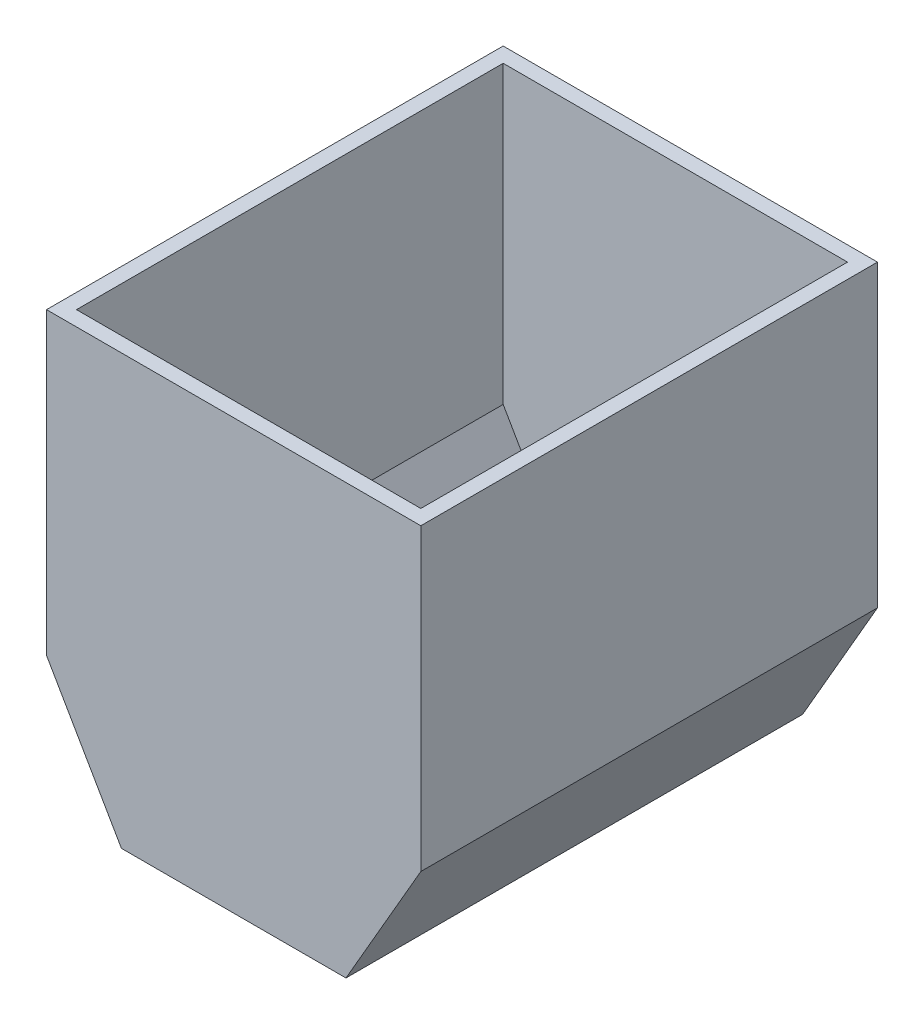
ISO-10303-21;
HEADER;
FILE_DESCRIPTION(('STEP AP214'),'2;1');
FILE_NAME('part.step','',(''),(''),'','','');
FILE_SCHEMA(('AUTOMOTIVE_DESIGN { 1 0 10303 214 1 1 1 1 }'));
ENDSEC;
DATA;
#1=APPLICATION_CONTEXT('core data for automotive mechanical design processes');
#2=APPLICATION_PROTOCOL_DEFINITION('international standard','automotive_design',2000,#1);
#3=PRODUCT_CONTEXT('',#1,'mechanical');
#4=PRODUCT('Part','Part','',(#3));
#5=PRODUCT_RELATED_PRODUCT_CATEGORY('part','',(#4));
#6=PRODUCT_DEFINITION_FORMATION('','',#4);
#7=PRODUCT_DEFINITION_CONTEXT('part definition',#1,'design');
#8=PRODUCT_DEFINITION('design','',#6,#7);
#9=PRODUCT_DEFINITION_SHAPE('','',#8);
#10=(LENGTH_UNIT() NAMED_UNIT(*) SI_UNIT(.MILLI.,.METRE.));
#11=(NAMED_UNIT(*) PLANE_ANGLE_UNIT() SI_UNIT($,.RADIAN.));
#12=(NAMED_UNIT(*) SI_UNIT($,.STERADIAN.) SOLID_ANGLE_UNIT());
#13=UNCERTAINTY_MEASURE_WITH_UNIT(LENGTH_MEASURE(1.E-05),#10,'distance_accuracy_value','');
#14=(GEOMETRIC_REPRESENTATION_CONTEXT(3) GLOBAL_UNCERTAINTY_ASSIGNED_CONTEXT((#13)) GLOBAL_UNIT_ASSIGNED_CONTEXT((#10,
#11,#12)) REPRESENTATION_CONTEXT('',''));
#15=CARTESIAN_POINT('',(0.,0.,0.));
#16=DIRECTION('',(0.,0.,1.));
#17=DIRECTION('',(1.,0.,0.));
#18=AXIS2_PLACEMENT_3D('',#15,#16,#17);
#19=CARTESIAN_POINT('',(31.75,72.7970452561247,38.735));
#20=DIRECTION('',(0.,-1.,0.));
#21=DIRECTION('',(0.,0.,-1.));
#22=AXIS2_PLACEMENT_3D('',#19,#20,#21);
#23=PLANE('',#22);
#24=DIRECTION('',(-1.,0.,0.));
#25=VECTOR('',#24,1.);
#26=CARTESIAN_POINT('',(31.75,72.7970452561247,-38.735));
#27=LINE('',#26,#25);
#28=CARTESIAN_POINT('',(31.75,72.7970452561247,-38.735));
#29=VERTEX_POINT('',#28);
#30=CARTESIAN_POINT('',(-31.75,72.7970452561247,-38.735));
#31=VERTEX_POINT('',#30);
#32=EDGE_CURVE('E263',#29,#31,#27,.T.);
#33=ORIENTED_EDGE('',*,*,#32,.T.);
#34=DIRECTION('',(0.,0.,-1.));
#35=VECTOR('',#34,1.);
#36=CARTESIAN_POINT('',(-31.75,72.7970452561247,38.735));
#37=LINE('',#36,#35);
#38=CARTESIAN_POINT('',(-31.75,72.7970452561247,38.735));
#39=VERTEX_POINT('',#38);
#40=EDGE_CURVE('E51',#39,#31,#37,.T.);
#41=ORIENTED_EDGE('',*,*,#40,.F.);
#42=DIRECTION('',(-1.,0.,0.));
#43=VECTOR('',#42,1.);
#44=CARTESIAN_POINT('',(31.75,72.7970452561247,38.735));
#45=LINE('',#44,#43);
#46=CARTESIAN_POINT('',(31.75,72.7970452561247,38.735));
#47=VERTEX_POINT('',#46);
#48=EDGE_CURVE('E243',#47,#39,#45,.T.);
#49=ORIENTED_EDGE('',*,*,#48,.F.);
#50=DIRECTION('',(0.,0.,-1.));
#51=VECTOR('',#50,1.);
#52=CARTESIAN_POINT('',(31.75,72.7970452561247,38.735));
#53=LINE('',#52,#51);
#54=EDGE_CURVE('E11',#47,#29,#53,.T.);
#55=ORIENTED_EDGE('',*,*,#54,.T.);
#56=EDGE_LOOP('',(#33,#41,#49,#55));
#57=FACE_BOUND('',#56,.T.);
#58=DIRECTION('',(-1.,0.,0.));
#59=VECTOR('',#58,1.);
#60=CARTESIAN_POINT('',(31.75,72.7970452561247,-36.195));
#61=LINE('',#60,#59);
#62=CARTESIAN_POINT('',(29.21,72.7970452561247,-36.195));
#63=VERTEX_POINT('',#62);
#64=CARTESIAN_POINT('',(-29.21,72.7970452561247,-36.195));
#65=VERTEX_POINT('',#64);
#66=EDGE_CURVE('E189',#63,#65,#61,.T.);
#67=ORIENTED_EDGE('',*,*,#66,.F.);
#68=DIRECTION('',(0.,0.,-1.));
#69=VECTOR('',#68,1.);
#70=CARTESIAN_POINT('',(29.21,72.7970452561247,38.735));
#71=LINE('',#70,#69);
#72=CARTESIAN_POINT('',(29.21,72.7970452561247,36.195));
#73=VERTEX_POINT('',#72);
#74=EDGE_CURVE('E227',#73,#63,#71,.T.);
#75=ORIENTED_EDGE('',*,*,#74,.F.);
#76=DIRECTION('',(-1.,0.,0.));
#77=VECTOR('',#76,1.);
#78=CARTESIAN_POINT('',(31.75,72.7970452561247,36.195));
#79=LINE('',#78,#77);
#80=CARTESIAN_POINT('',(-29.21,72.7970452561247,36.195));
#81=VERTEX_POINT('',#80);
#82=EDGE_CURVE('E192',#73,#81,#79,.T.);
#83=ORIENTED_EDGE('',*,*,#82,.T.);
#84=DIRECTION('',(0.,0.,-1.));
#85=VECTOR('',#84,1.);
#86=CARTESIAN_POINT('',(-29.21,72.7970452561247,38.735));
#87=LINE('',#86,#85);
#88=EDGE_CURVE('E222',#81,#65,#87,.T.);
#89=ORIENTED_EDGE('',*,*,#88,.T.);
#90=EDGE_LOOP('',(#67,#75,#83,#89));
#91=FACE_BOUND('',#90,.T.);
#92=ADVANCED_FACE('F42',(#57,#91),#23,.F.);
#93=CARTESIAN_POINT('',(31.75,21.9970452561247,38.735));
#94=DIRECTION('',(-1.,0.,0.));
#95=DIRECTION('',(0.,-1.,0.));
#96=AXIS2_PLACEMENT_3D('',#93,#94,#95);
#97=PLANE('',#96);
#98=DIRECTION('',(0.,1.,0.));
#99=VECTOR('',#98,1.);
#100=CARTESIAN_POINT('',(31.75,21.9970452561247,-38.735));
#101=LINE('',#100,#99);
#102=CARTESIAN_POINT('',(31.75,21.9970452561247,-38.735));
#103=VERTEX_POINT('',#102);
#104=EDGE_CURVE('E230',#103,#29,#101,.T.);
#105=ORIENTED_EDGE('',*,*,#104,.T.);
#106=ORIENTED_EDGE('',*,*,#54,.F.);
#107=DIRECTION('',(0.,1.,0.));
#108=VECTOR('',#107,1.);
#109=CARTESIAN_POINT('',(31.75,21.9970452561247,38.735));
#110=LINE('',#109,#108);
#111=CARTESIAN_POINT('',(31.75,21.9970452561247,38.735));
#112=VERTEX_POINT('',#111);
#113=EDGE_CURVE('E239',#112,#47,#110,.T.);
#114=ORIENTED_EDGE('',*,*,#113,.F.);
#115=DIRECTION('',(0.,0.,-1.));
#116=VECTOR('',#115,1.);
#117=CARTESIAN_POINT('',(31.75,21.9970452561247,38.735));
#118=LINE('',#117,#116);
#119=EDGE_CURVE('E259',#112,#103,#118,.T.);
#120=ORIENTED_EDGE('',*,*,#119,.T.);
#121=EDGE_LOOP('',(#105,#106,#114,#120));
#122=FACE_BOUND('',#121,.T.);
#123=ADVANCED_FACE('F44',(#122),#97,.F.);
#124=CARTESIAN_POINT('',(-31.75,72.7970452561247,38.735));
#125=DIRECTION('',(1.,0.,0.));
#126=DIRECTION('',(0.,0.,-1.));
#127=AXIS2_PLACEMENT_3D('',#124,#125,#126);
#128=PLANE('',#127);
#129=DIRECTION('',(0.,-1.,0.));
#130=VECTOR('',#129,1.);
#131=CARTESIAN_POINT('',(-31.75,72.7970452561247,-38.735));
#132=LINE('',#131,#130);
#133=CARTESIAN_POINT('',(-31.75,21.9970452561247,-38.735));
#134=VERTEX_POINT('',#133);
#135=EDGE_CURVE('E266',#31,#134,#132,.T.);
#136=ORIENTED_EDGE('',*,*,#135,.T.);
#137=DIRECTION('',(0.,0.,-1.));
#138=VECTOR('',#137,1.);
#139=CARTESIAN_POINT('',(-31.75,21.9970452561247,38.735));
#140=LINE('',#139,#138);
#141=CARTESIAN_POINT('',(-31.75,21.9970452561247,38.735));
#142=VERTEX_POINT('',#141);
#143=EDGE_CURVE('E288',#142,#134,#140,.T.);
#144=ORIENTED_EDGE('',*,*,#143,.F.);
#145=DIRECTION('',(0.,-1.,0.));
#146=VECTOR('',#145,1.);
#147=CARTESIAN_POINT('',(-31.75,72.7970452561247,38.735));
#148=LINE('',#147,#146);
#149=EDGE_CURVE('E247',#39,#142,#148,.T.);
#150=ORIENTED_EDGE('',*,*,#149,.F.);
#151=ORIENTED_EDGE('',*,*,#40,.T.);
#152=EDGE_LOOP('',(#136,#144,#150,#151));
#153=FACE_BOUND('',#152,.T.);
#154=ADVANCED_FACE('F298',(#153),#128,.F.);
#155=CARTESIAN_POINT('',(-31.75,21.9970452561247,38.735));
#156=DIRECTION('',(0.866025403784438,0.500000000000001,0.));
#157=DIRECTION('',(-0.500000000000001,0.866025403784438,0.));
#158=AXIS2_PLACEMENT_3D('',#155,#156,#157);
#159=PLANE('',#158);
#160=DIRECTION('',(0.500000000000001,-0.866025403784438,0.));
#161=VECTOR('',#160,1.);
#162=CARTESIAN_POINT('',(-31.75,21.9970452561247,-38.735));
#163=LINE('',#162,#161);
#164=CARTESIAN_POINT('',(-19.05,0.,-38.735));
#165=VERTEX_POINT('',#164);
#166=EDGE_CURVE('E269',#134,#165,#163,.T.);
#167=ORIENTED_EDGE('',*,*,#166,.T.);
#168=DIRECTION('',(0.,0.,-1.));
#169=VECTOR('',#168,1.);
#170=CARTESIAN_POINT('',(-19.05,0.,38.735));
#171=LINE('',#170,#169);
#172=CARTESIAN_POINT('',(-19.05,0.,38.735));
#173=VERTEX_POINT('',#172);
#174=EDGE_CURVE('E284',#173,#165,#171,.T.);
#175=ORIENTED_EDGE('',*,*,#174,.F.);
#176=DIRECTION('',(0.500000000000001,-0.866025403784438,0.));
#177=VECTOR('',#176,1.);
#178=CARTESIAN_POINT('',(-31.75,21.9970452561247,38.735));
#179=LINE('',#178,#177);
#180=EDGE_CURVE('E250',#142,#173,#179,.T.);
#181=ORIENTED_EDGE('',*,*,#180,.F.);
#182=ORIENTED_EDGE('',*,*,#143,.T.);
#183=EDGE_LOOP('',(#167,#175,#181,#182));
#184=FACE_BOUND('',#183,.T.);
#185=ADVANCED_FACE('F309',(#184),#159,.F.);
#186=CARTESIAN_POINT('',(-19.05,0.,38.735));
#187=DIRECTION('',(0.,1.,0.));
#188=DIRECTION('',(-1.,0.,0.));
#189=AXIS2_PLACEMENT_3D('',#186,#187,#188);
#190=PLANE('',#189);
#191=DIRECTION('',(1.,0.,0.));
#192=VECTOR('',#191,1.);
#193=CARTESIAN_POINT('',(-17.5835303162583,0.,36.195));
#194=LINE('',#193,#192);
#195=CARTESIAN_POINT('',(-17.5835303162583,0.,36.195));
#196=VERTEX_POINT('',#195);
#197=CARTESIAN_POINT('',(17.5835303162583,0.,36.195));
#198=VERTEX_POINT('',#197);
#199=EDGE_CURVE('E157',#196,#198,#194,.T.);
#200=ORIENTED_EDGE('',*,*,#199,.T.);
#201=DIRECTION('',(0.,0.,-1.));
#202=VECTOR('',#201,1.);
#203=CARTESIAN_POINT('',(17.5835303162583,0.,-36.195));
#204=LINE('',#203,#202);
#205=CARTESIAN_POINT('',(17.5835303162583,0.,-36.195));
#206=VERTEX_POINT('',#205);
#207=EDGE_CURVE('E149',#198,#206,#204,.T.);
#208=ORIENTED_EDGE('',*,*,#207,.T.);
#209=DIRECTION('',(-1.,0.,0.));
#210=VECTOR('',#209,1.);
#211=CARTESIAN_POINT('',(-17.5835303162583,0.,-36.195));
#212=LINE('',#211,#210);
#213=CARTESIAN_POINT('',(-17.5835303162583,0.,-36.195));
#214=VERTEX_POINT('',#213);
#215=EDGE_CURVE('E160',#206,#214,#212,.T.);
#216=ORIENTED_EDGE('',*,*,#215,.T.);
#217=DIRECTION('',(0.,0.,1.));
#218=VECTOR('',#217,1.);
#219=CARTESIAN_POINT('',(-17.5835303162583,0.,-36.195));
#220=LINE('',#219,#218);
#221=EDGE_CURVE('E58',#214,#196,#220,.T.);
#222=ORIENTED_EDGE('',*,*,#221,.T.);
#223=EDGE_LOOP('',(#200,#208,#216,#222));
#224=FACE_BOUND('',#223,.T.);
#225=DIRECTION('',(1.,0.,0.));
#226=VECTOR('',#225,1.);
#227=CARTESIAN_POINT('',(-19.05,0.,-38.735));
#228=LINE('',#227,#226);
#229=CARTESIAN_POINT('',(19.05,0.,-38.735));
#230=VERTEX_POINT('',#229);
#231=EDGE_CURVE('E272',#165,#230,#228,.T.);
#232=ORIENTED_EDGE('',*,*,#231,.T.);
#233=DIRECTION('',(0.,0.,-1.));
#234=VECTOR('',#233,1.);
#235=CARTESIAN_POINT('',(19.05,0.,38.735));
#236=LINE('',#235,#234);
#237=CARTESIAN_POINT('',(19.05,0.,38.735));
#238=VERTEX_POINT('',#237);
#239=EDGE_CURVE('E280',#238,#230,#236,.T.);
#240=ORIENTED_EDGE('',*,*,#239,.F.);
#241=DIRECTION('',(1.,0.,0.));
#242=VECTOR('',#241,1.);
#243=CARTESIAN_POINT('',(-19.05,0.,38.735));
#244=LINE('',#243,#242);
#245=EDGE_CURVE('E253',#173,#238,#244,.T.);
#246=ORIENTED_EDGE('',*,*,#245,.F.);
#247=ORIENTED_EDGE('',*,*,#174,.T.);
#248=EDGE_LOOP('',(#232,#240,#246,#247));
#249=FACE_BOUND('',#248,.T.);
#250=ADVANCED_FACE('F167',(#224,#249),#190,.F.);
#251=CARTESIAN_POINT('',(19.05,0.,38.735));
#252=DIRECTION('',(-0.866025403784438,0.500000000000001,0.));
#253=DIRECTION('',(-0.500000000000001,-0.866025403784438,0.));
#254=AXIS2_PLACEMENT_3D('',#251,#252,#253);
#255=PLANE('',#254);
#256=DIRECTION('',(0.500000000000001,0.866025403784438,0.));
#257=VECTOR('',#256,1.);
#258=CARTESIAN_POINT('',(19.05,0.,-38.735));
#259=LINE('',#258,#257);
#260=EDGE_CURVE('E244',#230,#103,#259,.T.);
#261=ORIENTED_EDGE('',*,*,#260,.T.);
#262=ORIENTED_EDGE('',*,*,#119,.F.);
#263=DIRECTION('',(0.500000000000001,0.866025403784438,0.));
#264=VECTOR('',#263,1.);
#265=CARTESIAN_POINT('',(19.05,0.,38.735));
#266=LINE('',#265,#264);
#267=EDGE_CURVE('E256',#238,#112,#266,.T.);
#268=ORIENTED_EDGE('',*,*,#267,.F.);
#269=ORIENTED_EDGE('',*,*,#239,.T.);
#270=EDGE_LOOP('',(#261,#262,#268,#269));
#271=FACE_BOUND('',#270,.T.);
#272=ADVANCED_FACE('F322',(#271),#255,.F.);
#273=CARTESIAN_POINT('',(0.,0.,38.735));
#274=DIRECTION('',(0.,0.,1.));
#275=DIRECTION('',(1.,0.,0.));
#276=AXIS2_PLACEMENT_3D('',#273,#274,#275);
#277=PLANE('',#276);
#278=ORIENTED_EDGE('',*,*,#113,.T.);
#279=ORIENTED_EDGE('',*,*,#48,.T.);
#280=ORIENTED_EDGE('',*,*,#149,.T.);
#281=ORIENTED_EDGE('',*,*,#180,.T.);
#282=ORIENTED_EDGE('',*,*,#245,.T.);
#283=ORIENTED_EDGE('',*,*,#267,.T.);
#284=EDGE_LOOP('',(#278,#279,#280,#281,#282,#283));
#285=FACE_BOUND('',#284,.T.);
#286=ADVANCED_FACE('F315',(#285),#277,.T.);
#287=CARTESIAN_POINT('',(0.,0.,-38.735));
#288=DIRECTION('',(0.,0.,1.));
#289=DIRECTION('',(1.,0.,0.));
#290=AXIS2_PLACEMENT_3D('',#287,#288,#289);
#291=PLANE('',#290);
#292=ORIENTED_EDGE('',*,*,#104,.F.);
#293=ORIENTED_EDGE('',*,*,#260,.F.);
#294=ORIENTED_EDGE('',*,*,#231,.F.);
#295=ORIENTED_EDGE('',*,*,#166,.F.);
#296=ORIENTED_EDGE('',*,*,#135,.F.);
#297=ORIENTED_EDGE('',*,*,#32,.F.);
#298=EDGE_LOOP('',(#292,#293,#294,#295,#296,#297));
#299=FACE_BOUND('',#298,.T.);
#300=ADVANCED_FACE('F304',(#299),#291,.F.);
#301=CARTESIAN_POINT('',(29.21,21.9970452561247,38.735));
#302=DIRECTION('',(-1.,0.,0.));
#303=DIRECTION('',(0.,-1.,0.));
#304=AXIS2_PLACEMENT_3D('',#301,#302,#303);
#305=PLANE('',#304);
#306=DIRECTION('',(0.,1.,0.));
#307=VECTOR('',#306,1.);
#308=CARTESIAN_POINT('',(29.21,21.9970452561247,-36.195));
#309=LINE('',#308,#307);
#310=CARTESIAN_POINT('',(29.21,22.6776362048998,-36.195));
#311=VERTEX_POINT('',#310);
#312=EDGE_CURVE('E181',#311,#63,#309,.T.);
#313=ORIENTED_EDGE('',*,*,#312,.F.);
#314=DIRECTION('',(0.,0.,-1.));
#315=VECTOR('',#314,1.);
#316=CARTESIAN_POINT('',(29.21,22.6776362048998,38.735));
#317=LINE('',#316,#315);
#318=CARTESIAN_POINT('',(29.21,22.6776362048998,36.195));
#319=VERTEX_POINT('',#318);
#320=EDGE_CURVE('E194',#319,#311,#317,.T.);
#321=ORIENTED_EDGE('',*,*,#320,.F.);
#322=DIRECTION('',(0.,1.,0.));
#323=VECTOR('',#322,1.);
#324=CARTESIAN_POINT('',(29.21,21.9970452561247,36.195));
#325=LINE('',#324,#323);
#326=EDGE_CURVE('E66',#319,#73,#325,.T.);
#327=ORIENTED_EDGE('',*,*,#326,.T.);
#328=ORIENTED_EDGE('',*,*,#74,.T.);
#329=EDGE_LOOP('',(#313,#321,#327,#328));
#330=FACE_BOUND('',#329,.T.);
#331=ADVANCED_FACE('F369',(#330),#305,.T.);
#332=CARTESIAN_POINT('',(-29.21,72.7970452561247,38.735));
#333=DIRECTION('',(1.,0.,0.));
#334=DIRECTION('',(0.,0.,-1.));
#335=AXIS2_PLACEMENT_3D('',#332,#333,#334);
#336=PLANE('',#335);
#337=DIRECTION('',(0.,-1.,0.));
#338=VECTOR('',#337,1.);
#339=CARTESIAN_POINT('',(-29.21,72.7970452561247,-36.195));
#340=LINE('',#339,#338);
#341=CARTESIAN_POINT('',(-29.21,22.6776362048998,-36.195));
#342=VERTEX_POINT('',#341);
#343=EDGE_CURVE('E214',#65,#342,#340,.T.);
#344=ORIENTED_EDGE('',*,*,#343,.F.);
#345=ORIENTED_EDGE('',*,*,#88,.F.);
#346=DIRECTION('',(0.,-1.,0.));
#347=VECTOR('',#346,1.);
#348=CARTESIAN_POINT('',(-29.21,72.7970452561247,36.195));
#349=LINE('',#348,#347);
#350=CARTESIAN_POINT('',(-29.21,22.6776362048998,36.195));
#351=VERTEX_POINT('',#350);
#352=EDGE_CURVE('E218',#81,#351,#349,.T.);
#353=ORIENTED_EDGE('',*,*,#352,.T.);
#354=DIRECTION('',(0.,0.,-1.));
#355=VECTOR('',#354,1.);
#356=CARTESIAN_POINT('',(-29.21,22.6776362048998,38.735));
#357=LINE('',#356,#355);
#358=EDGE_CURVE('E211',#351,#342,#357,.T.);
#359=ORIENTED_EDGE('',*,*,#358,.T.);
#360=EDGE_LOOP('',(#344,#345,#353,#359));
#361=FACE_BOUND('',#360,.T.);
#362=ADVANCED_FACE('F378',(#361),#336,.T.);
#363=CARTESIAN_POINT('',(-29.5502954743875,23.2670452561247,38.735));
#364=DIRECTION('',(0.866025403784438,0.500000000000001,0.));
#365=DIRECTION('',(-0.500000000000001,0.866025403784438,0.));
#366=AXIS2_PLACEMENT_3D('',#363,#364,#365);
#367=PLANE('',#366);
#368=DIRECTION('',(0.500000000000001,-0.866025403784438,0.));
#369=VECTOR('',#368,1.);
#370=CARTESIAN_POINT('',(-29.5502954743875,23.2670452561247,-36.195));
#371=LINE('',#370,#369);
#372=CARTESIAN_POINT('',(-17.5835303162583,2.53999999999999,-36.195));
#373=VERTEX_POINT('',#372);
#374=EDGE_CURVE('E201',#342,#373,#371,.T.);
#375=ORIENTED_EDGE('',*,*,#374,.F.);
#376=ORIENTED_EDGE('',*,*,#358,.F.);
#377=DIRECTION('',(0.500000000000001,-0.866025403784438,0.));
#378=VECTOR('',#377,1.);
#379=CARTESIAN_POINT('',(-29.5502954743875,23.2670452561247,36.195));
#380=LINE('',#379,#378);
#381=CARTESIAN_POINT('',(-17.5835303162583,2.53999999999999,36.195));
#382=VERTEX_POINT('',#381);
#383=EDGE_CURVE('E204',#351,#382,#380,.T.);
#384=ORIENTED_EDGE('',*,*,#383,.T.);
#385=DIRECTION('',(0.,0.,-1.));
#386=VECTOR('',#385,1.);
#387=CARTESIAN_POINT('',(-17.5835303162583,2.53999999999999,38.735));
#388=LINE('',#387,#386);
#389=EDGE_CURVE('E207',#382,#373,#388,.T.);
#390=ORIENTED_EDGE('',*,*,#389,.T.);
#391=EDGE_LOOP('',(#375,#376,#384,#390));
#392=FACE_BOUND('',#391,.T.);
#393=ADVANCED_FACE('F386',(#392),#367,.T.);
#394=CARTESIAN_POINT('',(16.8502954743875,1.26999999999999,38.735));
#395=DIRECTION('',(-0.866025403784438,0.500000000000001,0.));
#396=DIRECTION('',(-0.500000000000001,-0.866025403784438,0.));
#397=AXIS2_PLACEMENT_3D('',#394,#395,#396);
#398=PLANE('',#397);
#399=DIRECTION('',(0.500000000000001,0.866025403784438,0.));
#400=VECTOR('',#399,1.);
#401=CARTESIAN_POINT('',(16.8502954743875,1.26999999999999,-36.195));
#402=LINE('',#401,#400);
#403=CARTESIAN_POINT('',(17.5835303162583,2.53999999999998,-36.195));
#404=VERTEX_POINT('',#403);
#405=EDGE_CURVE('E193',#404,#311,#402,.T.);
#406=ORIENTED_EDGE('',*,*,#405,.F.);
#407=DIRECTION('',(0.,0.,-1.));
#408=VECTOR('',#407,1.);
#409=CARTESIAN_POINT('',(17.5835303162583,2.53999999999999,38.735));
#410=LINE('',#409,#408);
#411=CARTESIAN_POINT('',(17.5835303162583,2.53999999999999,36.195));
#412=VERTEX_POINT('',#411);
#413=EDGE_CURVE('E152',#412,#404,#410,.T.);
#414=ORIENTED_EDGE('',*,*,#413,.F.);
#415=DIRECTION('',(0.500000000000001,0.866025403784438,0.));
#416=VECTOR('',#415,1.);
#417=CARTESIAN_POINT('',(16.8502954743875,1.26999999999999,36.195));
#418=LINE('',#417,#416);
#419=EDGE_CURVE('E198',#412,#319,#418,.T.);
#420=ORIENTED_EDGE('',*,*,#419,.T.);
#421=ORIENTED_EDGE('',*,*,#320,.T.);
#422=EDGE_LOOP('',(#406,#414,#420,#421));
#423=FACE_BOUND('',#422,.T.);
#424=ADVANCED_FACE('F395',(#423),#398,.T.);
#425=CARTESIAN_POINT('',(0.,0.,36.195));
#426=DIRECTION('',(0.,0.,1.));
#427=DIRECTION('',(1.,0.,0.));
#428=AXIS2_PLACEMENT_3D('',#425,#426,#427);
#429=PLANE('',#428);
#430=ORIENTED_EDGE('',*,*,#326,.F.);
#431=ORIENTED_EDGE('',*,*,#419,.F.);
#432=DIRECTION('',(0.,1.,0.));
#433=VECTOR('',#432,1.);
#434=CARTESIAN_POINT('',(17.5835303162583,0.,36.195));
#435=LINE('',#434,#433);
#436=EDGE_CURVE('E178',#198,#412,#435,.T.);
#437=ORIENTED_EDGE('',*,*,#436,.F.);
#438=ORIENTED_EDGE('',*,*,#199,.F.);
#439=DIRECTION('',(0.,1.,0.));
#440=VECTOR('',#439,1.);
#441=CARTESIAN_POINT('',(-17.5835303162583,0.,36.195));
#442=LINE('',#441,#440);
#443=EDGE_CURVE('E182',#196,#382,#442,.T.);
#444=ORIENTED_EDGE('',*,*,#443,.T.);
#445=ORIENTED_EDGE('',*,*,#383,.F.);
#446=ORIENTED_EDGE('',*,*,#352,.F.);
#447=ORIENTED_EDGE('',*,*,#82,.F.);
#448=EDGE_LOOP('',(#430,#431,#437,#438,#444,#445,#446,#447));
#449=FACE_BOUND('',#448,.T.);
#450=ADVANCED_FACE('F405',(#449),#429,.F.);
#451=CARTESIAN_POINT('',(0.,0.,-36.195));
#452=DIRECTION('',(0.,0.,1.));
#453=DIRECTION('',(1.,0.,0.));
#454=AXIS2_PLACEMENT_3D('',#451,#452,#453);
#455=PLANE('',#454);
#456=ORIENTED_EDGE('',*,*,#312,.T.);
#457=ORIENTED_EDGE('',*,*,#66,.T.);
#458=ORIENTED_EDGE('',*,*,#343,.T.);
#459=ORIENTED_EDGE('',*,*,#374,.T.);
#460=DIRECTION('',(0.,1.,0.));
#461=VECTOR('',#460,1.);
#462=CARTESIAN_POINT('',(-17.5835303162583,0.,-36.195));
#463=LINE('',#462,#461);
#464=EDGE_CURVE('E156',#214,#373,#463,.T.);
#465=ORIENTED_EDGE('',*,*,#464,.F.);
#466=ORIENTED_EDGE('',*,*,#215,.F.);
#467=DIRECTION('',(0.,1.,0.));
#468=VECTOR('',#467,1.);
#469=CARTESIAN_POINT('',(17.5835303162583,0.,-36.195));
#470=LINE('',#469,#468);
#471=EDGE_CURVE('E145',#206,#404,#470,.T.);
#472=ORIENTED_EDGE('',*,*,#471,.T.);
#473=ORIENTED_EDGE('',*,*,#405,.T.);
#474=EDGE_LOOP('',(#456,#457,#458,#459,#465,#466,#472,#473));
#475=FACE_BOUND('',#474,.T.);
#476=ADVANCED_FACE('F162',(#475),#455,.T.);
#477=CARTESIAN_POINT('',(17.5835303162583,0.,-36.195));
#478=DIRECTION('',(1.,0.,0.));
#479=DIRECTION('',(0.,1.,0.));
#480=AXIS2_PLACEMENT_3D('',#477,#478,#479);
#481=PLANE('',#480);
#482=ORIENTED_EDGE('',*,*,#413,.T.);
#483=ORIENTED_EDGE('',*,*,#471,.F.);
#484=ORIENTED_EDGE('',*,*,#207,.F.);
#485=ORIENTED_EDGE('',*,*,#436,.T.);
#486=EDGE_LOOP('',(#482,#483,#484,#485));
#487=FACE_BOUND('',#486,.T.);
#488=ADVANCED_FACE('F147',(#487),#481,.F.);
#489=CARTESIAN_POINT('',(-17.5835303162583,0.,-36.195));
#490=DIRECTION('',(-1.,0.,0.));
#491=DIRECTION('',(0.,-1.,0.));
#492=AXIS2_PLACEMENT_3D('',#489,#490,#491);
#493=PLANE('',#492);
#494=ORIENTED_EDGE('',*,*,#389,.F.);
#495=ORIENTED_EDGE('',*,*,#443,.F.);
#496=ORIENTED_EDGE('',*,*,#221,.F.);
#497=ORIENTED_EDGE('',*,*,#464,.T.);
#498=EDGE_LOOP('',(#494,#495,#496,#497));
#499=FACE_BOUND('',#498,.T.);
#500=ADVANCED_FACE('F432',(#499),#493,.F.);
#501=CLOSED_SHELL('',(#92,#123,#154,#185,#250,#272,#286,#300,#331,#362,#393,#424,#450,#476,#488,#500));
#502=MANIFOLD_SOLID_BREP('B2',#501);
#503=ADVANCED_BREP_SHAPE_REPRESENTATION('',(#18,#502),#14);
#504=SHAPE_DEFINITION_REPRESENTATION(#9,#503);
ENDSEC;
END-ISO-10303-21;
